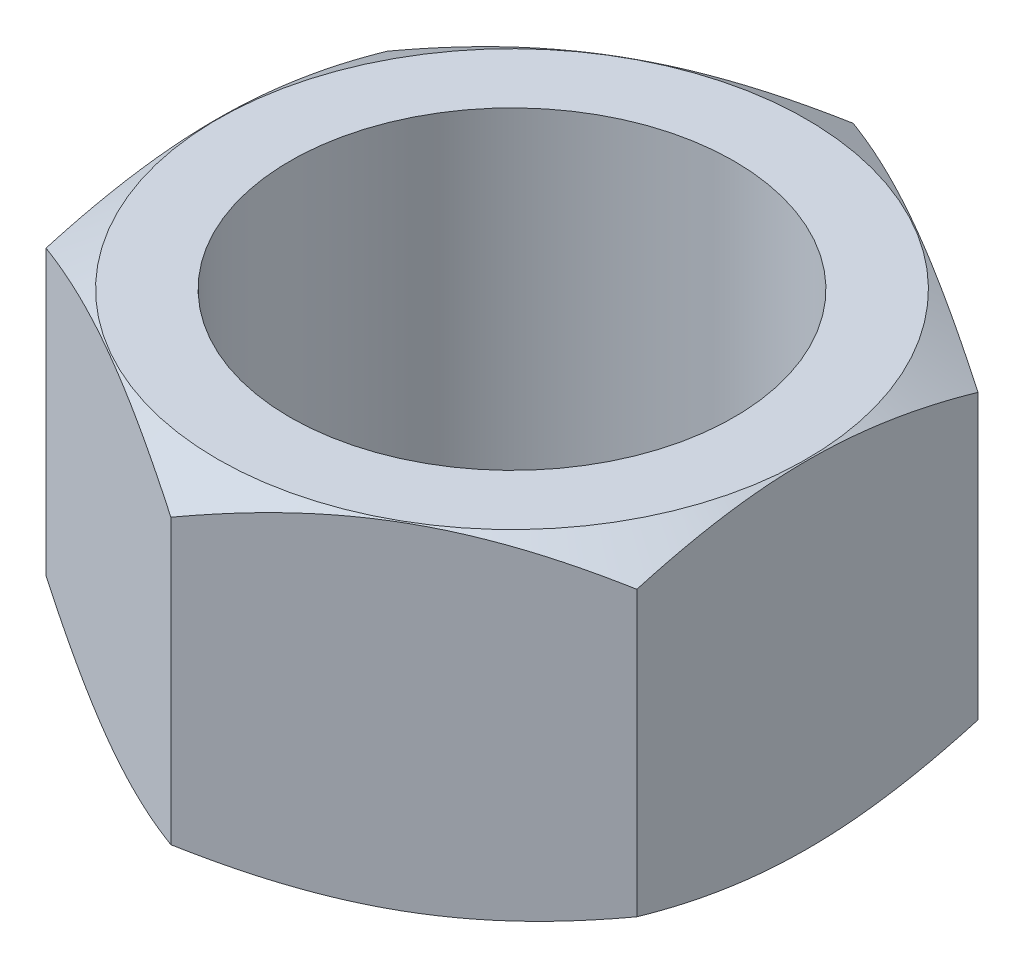
ISO-10303-21;
HEADER;
FILE_DESCRIPTION(('STEP AP214'),'2;1');
FILE_NAME('part.step','',(''),(''),'','','');
FILE_SCHEMA(('AUTOMOTIVE_DESIGN { 1 0 10303 214 1 1 1 1 }'));
ENDSEC;
DATA;
#1=APPLICATION_CONTEXT('core data for automotive mechanical design processes');
#2=APPLICATION_PROTOCOL_DEFINITION('international standard','automotive_design',2000,#1);
#3=PRODUCT_CONTEXT('',#1,'mechanical');
#4=PRODUCT('Part','Part','',(#3));
#5=PRODUCT_RELATED_PRODUCT_CATEGORY('part','',(#4));
#6=PRODUCT_DEFINITION_FORMATION('','',#4);
#7=PRODUCT_DEFINITION_CONTEXT('part definition',#1,'design');
#8=PRODUCT_DEFINITION('design','',#6,#7);
#9=PRODUCT_DEFINITION_SHAPE('','',#8);
#10=(LENGTH_UNIT() NAMED_UNIT(*) SI_UNIT(.MILLI.,.METRE.));
#11=(NAMED_UNIT(*) PLANE_ANGLE_UNIT() SI_UNIT($,.RADIAN.));
#12=(NAMED_UNIT(*) SI_UNIT($,.STERADIAN.) SOLID_ANGLE_UNIT());
#13=UNCERTAINTY_MEASURE_WITH_UNIT(LENGTH_MEASURE(1.E-05),#10,'distance_accuracy_value','');
#14=(GEOMETRIC_REPRESENTATION_CONTEXT(3) GLOBAL_UNCERTAINTY_ASSIGNED_CONTEXT((#13)) GLOBAL_UNIT_ASSIGNED_CONTEXT((#10,
#11,#12)) REPRESENTATION_CONTEXT('',''));
#15=CARTESIAN_POINT('',(0.,0.,0.));
#16=DIRECTION('',(0.,0.,1.));
#17=DIRECTION('',(1.,0.,0.));
#18=AXIS2_PLACEMENT_3D('',#15,#16,#17);
#19=CARTESIAN_POINT('',(-0.175,0.1,0.101036297108185));
#20=DIRECTION('',(0.5,0.,-0.866025403784439));
#21=DIRECTION('',(-0.866025403784439,0.,-0.5));
#22=AXIS2_PLACEMENT_3D('',#19,#20,#21);
#23=PLANE('',#22);
#24=CARTESIAN_POINT('',(0.000199999999999946,-0.0839108549334894,0.202188064270207));
#25=CARTESIAN_POINT('',(-0.0074937108815989,-0.08648024872338,0.197746098221649));
#26=CARTESIAN_POINT('',(-0.01525361122164,-0.0888181253854202,0.193265917671441));
#27=CARTESIAN_POINT('',(-0.0309080447479305,-0.0929007676395554,0.184227826261026));
#28=CARTESIAN_POINT('',(-0.0388028580338777,-0.0946440858715775,0.179669753685183));
#29=CARTESIAN_POINT('',(-0.054494971460544,-0.0973597017903497,0.170609907774143));
#30=CARTESIAN_POINT('',(-0.0622898336153238,-0.0983500501729253,0.166109542010785));
#31=CARTESIAN_POINT('',(-0.0779149577125144,-0.0995387715709246,0.157088372407151));
#32=CARTESIAN_POINT('',(-0.0857451641291545,-0.0997381199822329,0.152567600624693));
#33=CARTESIAN_POINT('',(-0.10724205060278,-0.0991579607700383,0.140156367432407));
#34=CARTESIAN_POINT('',(-0.120896921259255,-0.097535502352548,0.132272724183141));
#35=CARTESIAN_POINT('',(-0.141278654337267,-0.0935282473709126,0.120505325104));
#36=CARTESIAN_POINT('',(-0.14813257332687,-0.0919025782558418,0.116548213130348));
#37=CARTESIAN_POINT('',(-0.16173889982426,-0.0882119622722512,0.108692596864399));
#38=CARTESIAN_POINT('',(-0.16849146778477,-0.0861478110160721,0.104793999934677));
#39=CARTESIAN_POINT('',(-0.1752,-0.0839108549334894,0.100920827054347));
#40=B_SPLINE_CURVE_WITH_KNOTS('',3,(#24,#25,#26,#27,#28,#29,#30,#31,#32,#33,#34,#35,#36,#37,#38,
#39),.UNSPECIFIED.,.F.,.F.,(4,2,2,2,2,2,2,4),(0.,0.0277547258420524,0.0555765418822849,
0.0827083119886982,0.109806615018668,0.157158113827718,0.181387395708681,0.205573084193857),.UNSPECIFIED.);
#41=CARTESIAN_POINT('',(0.,-0.0839775787103655,0.202072594216368));
#42=VERTEX_POINT('',#41);
#43=CARTESIAN_POINT('',(-0.175,-0.0839775787103648,0.101036297108185));
#44=VERTEX_POINT('',#43);
#45=EDGE_CURVE('E60',#42,#44,#40,.T.);
#46=ORIENTED_EDGE('',*,*,#45,.F.);
#47=DIRECTION('',(0.,-1.,0.));
#48=VECTOR('',#47,1.);
#49=CARTESIAN_POINT('',(0.,0.1,0.202072594216369));
#50=LINE('',#49,#48);
#51=CARTESIAN_POINT('',(0.,0.0840435185201128,0.202072594216368));
#52=VERTEX_POINT('',#51);
#53=EDGE_CURVE('E53',#52,#42,#50,.T.);
#54=ORIENTED_EDGE('',*,*,#53,.F.);
#55=CARTESIAN_POINT('',(-0.1752,0.0839767947432367,0.100920827054347));
#56=CARTESIAN_POINT('',(-0.167506289118401,0.0865461885331273,0.105362793102905));
#57=CARTESIAN_POINT('',(-0.15974638877836,0.0888840651951676,0.109842973653112));
#58=CARTESIAN_POINT('',(-0.14409195525207,0.0929667074493027,0.118881065063527));
#59=CARTESIAN_POINT('',(-0.136197141966122,0.0947100256813248,0.123439137639371));
#60=CARTESIAN_POINT('',(-0.120505028539456,0.097425641600097,0.132498983550411));
#61=CARTESIAN_POINT('',(-0.112710166384676,0.0984159899826726,0.136999349313769));
#62=CARTESIAN_POINT('',(-0.0970850422874857,0.0996047113806719,0.146020518917403));
#63=CARTESIAN_POINT('',(-0.0892548358708456,0.0998040597919802,0.15054129069986));
#64=CARTESIAN_POINT('',(-0.0677579493972203,0.0992239005797856,0.162952523892147));
#65=CARTESIAN_POINT('',(-0.0541030787407451,0.0976014421622953,0.170836167141412));
#66=CARTESIAN_POINT('',(-0.033721345662733,0.0935941871806599,0.182603566220554));
#67=CARTESIAN_POINT('',(-0.0268674266731297,0.0919685180655891,0.186560678194205));
#68=CARTESIAN_POINT('',(-0.0132611001757402,0.0882779020819985,0.194416294460155));
#69=CARTESIAN_POINT('',(-0.00650853221523054,0.0862137508258194,0.198314891389876));
#70=CARTESIAN_POINT('',(0.000199999999999964,0.0839767947432367,0.202188064270207));
#71=B_SPLINE_CURVE_WITH_KNOTS('',3,(#55,#56,#57,#58,#59,#60,#61,#62,#63,#64,#65,#66,#67,#68,#69,
#70),.UNSPECIFIED.,.F.,.F.,(4,2,2,2,2,2,2,4),(0.,0.0277547258420523,0.0555765418822849,
0.0827083119886982,0.109806615018668,0.157158113827718,0.181387395708681,0.205573084193857),.UNSPECIFIED.);
#72=CARTESIAN_POINT('',(-0.175,0.0840435185201121,0.101036297108185));
#73=VERTEX_POINT('',#72);
#74=EDGE_CURVE('E138',#73,#52,#71,.T.);
#75=ORIENTED_EDGE('',*,*,#74,.F.);
#76=DIRECTION('',(0.,-1.,0.));
#77=VECTOR('',#76,1.);
#78=CARTESIAN_POINT('',(-0.175,0.1,0.101036297108185));
#79=LINE('',#78,#77);
#80=EDGE_CURVE('E115',#73,#44,#79,.T.);
#81=ORIENTED_EDGE('',*,*,#80,.T.);
#82=EDGE_LOOP('',(#46,#54,#75,#81));
#83=FACE_BOUND('',#82,.T.);
#84=ADVANCED_FACE('F39',(#83),#23,.F.);
#85=CARTESIAN_POINT('',(0.,0.1,0.202072594216369));
#86=DIRECTION('',(-0.5,0.,-0.866025403784439));
#87=DIRECTION('',(-0.866025403784439,0.,0.5));
#88=AXIS2_PLACEMENT_3D('',#85,#86,#87);
#89=PLANE('',#88);
#90=CARTESIAN_POINT('',(0.1752,-0.0839108549334894,0.100920827054347));
#91=CARTESIAN_POINT('',(0.167506289118401,-0.0864802487233801,0.105362793102905));
#92=CARTESIAN_POINT('',(0.15974638877836,-0.0888181253854203,0.109842973653112));
#93=CARTESIAN_POINT('',(0.144091955252069,-0.0929007676395554,0.118881065063527));
#94=CARTESIAN_POINT('',(0.136197141966122,-0.0946440858715775,0.123439137639371));
#95=CARTESIAN_POINT('',(0.120505028539456,-0.0973597017903497,0.132498983550411));
#96=CARTESIAN_POINT('',(0.112710166384676,-0.0983500501729253,0.136999349313769));
#97=CARTESIAN_POINT('',(0.0970850422874856,-0.0995387715709246,0.146020518917403));
#98=CARTESIAN_POINT('',(0.0892548358708456,-0.0997381199822329,0.15054129069986));
#99=CARTESIAN_POINT('',(0.0677579493972202,-0.0991579607700383,0.162952523892147));
#100=CARTESIAN_POINT('',(0.0541030787407451,-0.097535502352548,0.170836167141412));
#101=CARTESIAN_POINT('',(0.0337213456627329,-0.0935282473709126,0.182603566220554));
#102=CARTESIAN_POINT('',(0.0268674266731297,-0.0919025782558418,0.186560678194205));
#103=CARTESIAN_POINT('',(0.0132611001757401,-0.0882119622722512,0.194416294460155));
#104=CARTESIAN_POINT('',(0.00650853221523049,-0.0861478110160721,0.198314891389876));
#105=CARTESIAN_POINT('',(-0.000200000000000046,-0.0839108549334894,0.202188064270207));
#106=B_SPLINE_CURVE_WITH_KNOTS('',3,(#90,#91,#92,#93,#94,#95,#96,#97,#98,#99,#100,#101,#102,
#103,#104,#105),.UNSPECIFIED.,.F.,.F.,(4,2,2,2,2,2,2,4),(0.,0.0277547258420524,
0.0555765418822849,0.0827083119886982,0.109806615018668,0.157158113827718,0.181387395708681,
0.205573084193857),.UNSPECIFIED.);
#107=CARTESIAN_POINT('',(0.175,-0.0839775787103648,0.101036297108184));
#108=VERTEX_POINT('',#107);
#109=EDGE_CURVE('E134',#108,#42,#106,.T.);
#110=ORIENTED_EDGE('',*,*,#109,.F.);
#111=DIRECTION('',(0.,-1.,0.));
#112=VECTOR('',#111,1.);
#113=CARTESIAN_POINT('',(0.175,0.1,0.101036297108184));
#114=LINE('',#113,#112);
#115=CARTESIAN_POINT('',(0.175,0.0840435185338147,0.101036297133918));
#116=VERTEX_POINT('',#115);
#117=EDGE_CURVE('E125',#116,#108,#114,.T.);
#118=ORIENTED_EDGE('',*,*,#117,.F.);
#119=CARTESIAN_POINT('',(-0.000200000000000051,0.0839767947432367,0.202188064270207));
#120=CARTESIAN_POINT('',(0.00749371088159879,0.0865461885331273,0.197746098221649));
#121=CARTESIAN_POINT('',(0.0152536112216398,0.0888840651951676,0.193265917671441));
#122=CARTESIAN_POINT('',(0.0309080447479304,0.0929667074493027,0.184227826261026));
#123=CARTESIAN_POINT('',(0.0388028580338776,0.0947100256813248,0.179669753685183));
#124=CARTESIAN_POINT('',(0.0544949714605439,0.097425641600097,0.170609907774143));
#125=CARTESIAN_POINT('',(0.0622898336153237,0.0984159899826726,0.166109542010785));
#126=CARTESIAN_POINT('',(0.0779149577125143,0.099604711380672,0.157088372407151));
#127=CARTESIAN_POINT('',(0.0857451641291544,0.0998040597919802,0.152567600624693));
#128=CARTESIAN_POINT('',(0.10724205060278,0.0992239005797856,0.140156367432407));
#129=CARTESIAN_POINT('',(0.120896921259255,0.0976014421622953,0.132272724183141));
#130=CARTESIAN_POINT('',(0.141278654337267,0.0935941871806599,0.120505325104));
#131=CARTESIAN_POINT('',(0.14813257332687,0.0919685180655891,0.116548213130348));
#132=CARTESIAN_POINT('',(0.16173889982426,0.0882779020819986,0.108692596864399));
#133=CARTESIAN_POINT('',(0.168491467784769,0.0862137508258195,0.104793999934677));
#134=CARTESIAN_POINT('',(0.1752,0.0839767947432367,0.100920827054347));
#135=B_SPLINE_CURVE_WITH_KNOTS('',3,(#119,#120,#121,#122,#123,#124,#125,#126,#127,#128,#129,
#130,#131,#132,#133,#134),.UNSPECIFIED.,.F.,.F.,(4,2,2,2,2,2,2,4),(0.,0.0277547258420523,
0.0555765418822849,0.0827083119886982,0.109806615018668,0.157158113827718,0.181387395708681,
0.205573084193857),.UNSPECIFIED.);
#136=EDGE_CURVE('E135',#52,#116,#135,.T.);
#137=ORIENTED_EDGE('',*,*,#136,.F.);
#138=ORIENTED_EDGE('',*,*,#53,.T.);
#139=EDGE_LOOP('',(#110,#118,#137,#138));
#140=FACE_BOUND('',#139,.T.);
#141=ADVANCED_FACE('F132',(#140),#89,.F.);
#142=CARTESIAN_POINT('',(0.175,0.1,0.101036297108184));
#143=DIRECTION('',(-1.,0.,0.));
#144=DIRECTION('',(0.,0.,1.));
#145=AXIS2_PLACEMENT_3D('',#142,#143,#144);
#146=PLANE('',#145);
#147=CARTESIAN_POINT('',(0.175,0.0422895932351457,-0.382655915710894));
#148=CARTESIAN_POINT('',(0.175,0.0330727436131562,-0.365080805778269));
#149=CARTESIAN_POINT('',(0.175,0.0239250208724509,-0.347467542984239));
#150=CARTESIAN_POINT('',(0.175,0.0058745090921353,-0.312085832869629));
#151=CARTESIAN_POINT('',(0.175,-0.00302792649170072,-0.294317205716732));
#152=CARTESIAN_POINT('',(0.175,-0.0209542752882,-0.257570859999184));
#153=CARTESIAN_POINT('',(0.175,-0.029955944858787,-0.238582177080006));
#154=CARTESIAN_POINT('',(0.175,-0.047240303020974,-0.20028836082484));
#155=CARTESIAN_POINT('',(0.175,-0.055523400933287,-0.180983415192714));
#156=CARTESIAN_POINT('',(0.175,-0.0716478569374931,-0.139834837148152));
#157=CARTESIAN_POINT('',(0.175,-0.0793534511725074,-0.117936142668139));
#158=CARTESIAN_POINT('',(0.175,-0.091565599523792,-0.0736649849921621));
#159=CARTESIAN_POINT('',(0.175,-0.0961385194604931,-0.051313401426804));
#160=CARTESIAN_POINT('',(0.175,-0.0993366812364518,-0.0171949722496616));
#161=CARTESIAN_POINT('',(0.175,-0.0997778466929678,-0.00560451620327899));
#162=CARTESIAN_POINT('',(0.175,-0.0993204141178539,0.0175488549520587));
#163=CARTESIAN_POINT('',(0.175,-0.0984217739672306,0.029111769183746));
#164=CARTESIAN_POINT('',(0.175,-0.0953958138127121,0.0523291828036099));
#165=CARTESIAN_POINT('',(0.175,-0.0932416928059721,0.0639800283462536));
#166=CARTESIAN_POINT('',(0.175,-0.0879613207981097,0.0870592097042493));
#167=CARTESIAN_POINT('',(0.175,-0.0848344123187147,0.0984873894585864));
#168=CARTESIAN_POINT('',(0.175,-0.0737869744950067,0.134532281625198));
#169=CARTESIAN_POINT('',(0.175,-0.0645745438817558,0.158742117475776));
#170=CARTESIAN_POINT('',(0.175,-0.0446345954033697,0.206539986704181));
#171=CARTESIAN_POINT('',(0.175,-0.033903964688386,0.230126621343133));
#172=CARTESIAN_POINT('',(0.175,-0.0124170779125606,0.275349799704907));
#173=CARTESIAN_POINT('',(0.175,-0.00171151394898988,0.297010448534193));
#174=CARTESIAN_POINT('',(0.175,0.0200665743867666,0.340015636465542));
#175=CARTESIAN_POINT('',(0.175,0.0311370686834192,0.361361198848282));
#176=CARTESIAN_POINT('',(0.175,0.0422895932351456,0.382655915710894));
#177=B_SPLINE_CURVE_WITH_KNOTS('',3,(#147,#148,#149,#150,#151,#152,#153,#154,#155,#156,#157,
#158,#159,#160,#161,#162,#163,#164,#165,#166,#167,#168,#169,#170,#171,#172,#173,#174,#175,#176),
.UNSPECIFIED.,.F.,.F.,(4,2,2,2,2,2,2,2,2,2,2,2,2,2,4),(0.,0.0595381664677372,0.119158060575418,
0.182192517886849,0.245190829758866,0.314747742330619,0.38278129721614,0.417500686440851,
0.452221167149692,0.48771148444748,0.523225840904367,0.600792873322725,0.678521314765829,
0.750999346963575,0.823126092267287),.UNSPECIFIED.);
#178=CARTESIAN_POINT('',(0.174999999999999,-0.0839775787103655,-0.101036297108185));
#179=VERTEX_POINT('',#178);
#180=EDGE_CURVE('E143',#179,#108,#177,.T.);
#181=ORIENTED_EDGE('',*,*,#180,.F.);
#182=DIRECTION('',(0.,-1.,0.));
#183=VECTOR('',#182,1.);
#184=CARTESIAN_POINT('',(0.175,0.1,-0.101036297108185));
#185=LINE('',#184,#183);
#186=CARTESIAN_POINT('',(0.174999999999999,0.0840435185201128,-0.101036297108185));
#187=VERTEX_POINT('',#186);
#188=EDGE_CURVE('E117',#187,#179,#185,.T.);
#189=ORIENTED_EDGE('',*,*,#188,.F.);
#190=CARTESIAN_POINT('',(0.175,-0.0422160195523276,0.382641376287039));
#191=CARTESIAN_POINT('',(0.175,-0.0329995049644952,0.365066788456258));
#192=CARTESIAN_POINT('',(0.175,-0.0238521200310131,0.347454046439632));
#193=CARTESIAN_POINT('',(0.175,-0.00580229266206557,0.312073372677754));
#194=CARTESIAN_POINT('',(0.175,0.00309979627185199,0.294305261078483));
#195=CARTESIAN_POINT('',(0.175,0.0210254104002451,0.257559986629171));
#196=CARTESIAN_POINT('',(0.175,0.0300266915011207,0.238571859315599));
#197=CARTESIAN_POINT('',(0.175,0.0473102505481433,0.200279150607368));
#198=CARTESIAN_POINT('',(0.175,0.0555929378565586,0.180974756932192));
#199=CARTESIAN_POINT('',(0.175,0.0717166057194088,0.1398270755635));
#200=CARTESIAN_POINT('',(0.175,0.079421801019417,0.117928718266305));
#201=CARTESIAN_POINT('',(0.175,0.0916330577897624,0.0736582389845543));
#202=CARTESIAN_POINT('',(0.175,0.0962054861934968,0.0513069958144394));
#203=CARTESIAN_POINT('',(0.175,0.0994029430841635,0.0171891920441579));
#204=CARTESIAN_POINT('',(0.175,0.0998438787923667,0.00559898160459053));
#205=CARTESIAN_POINT('',(0.175,0.099386053659298,-0.0175538774894773));
#206=CARTESIAN_POINT('',(0.175,0.0984872504572312,-0.0291165252609038));
#207=CARTESIAN_POINT('',(0.175,0.0954610442698862,-0.0523333883517469));
#208=CARTESIAN_POINT('',(0.175,0.0933068427800365,-0.0639839497939355));
#209=CARTESIAN_POINT('',(0.175,0.0880263847492042,-0.0870625695638328));
#210=CARTESIAN_POINT('',(0.175,0.0848994709625687,-0.0984904718798404));
#211=CARTESIAN_POINT('',(0.175,0.0738524249766441,-0.134533414221554));
#212=CARTESIAN_POINT('',(0.175,0.0646406250760388,-0.158741645360664));
#213=CARTESIAN_POINT('',(0.175,0.0447020969809935,-0.206536373306849));
#214=CARTESIAN_POINT('',(0.175,0.0339722567886575,-0.23012147178013));
#215=CARTESIAN_POINT('',(0.175,0.0124869109886767,-0.275341791344504));
#216=CARTESIAN_POINT('',(0.175,0.00178209135297784,-0.297001114506236));
#217=CARTESIAN_POINT('',(0.175,-0.0199945009407727,-0.340003683609622));
#218=CARTESIAN_POINT('',(0.175,-0.0310642439056464,-0.361347952631343));
#219=CARTESIAN_POINT('',(0.175,-0.0422160195523277,-0.38264137628704));
#220=B_SPLINE_CURVE_WITH_KNOTS('',3,(#190,#191,#192,#193,#194,#195,#196,#197,#198,#199,#200,
#201,#202,#203,#204,#205,#206,#207,#208,#209,#210,#211,#212,#213,#214,#215,#216,#217,#218,#219),
.UNSPECIFIED.,.F.,.F.,(4,2,2,2,2,2,2,2,2,2,2,2,2,2,4),(0.,0.0595363126319899,0.119154357928515,
0.182186808727986,0.24518311268493,0.31473866002924,0.382770907070877,0.417489538025976,
0.452209266762136,0.487698796640793,0.523212358486987,0.600774250179695,0.67849751268021,
0.750970991052047,0.823093255266633),.UNSPECIFIED.);
#221=EDGE_CURVE('E197',#116,#187,#220,.T.);
#222=ORIENTED_EDGE('',*,*,#221,.F.);
#223=ORIENTED_EDGE('',*,*,#117,.T.);
#224=EDGE_LOOP('',(#181,#189,#222,#223));
#225=FACE_BOUND('',#224,.T.);
#226=ADVANCED_FACE('F188',(#225),#146,.F.);
#227=CARTESIAN_POINT('',(0.175,0.1,-0.101036297108185));
#228=DIRECTION('',(-0.5,0.,0.866025403784439));
#229=DIRECTION('',(0.866025403784439,0.,0.5));
#230=AXIS2_PLACEMENT_3D('',#227,#228,#229);
#231=PLANE('',#230);
#232=CARTESIAN_POINT('',(-0.000199999999999998,-0.0839108549334893,-0.202188064270207));
#233=CARTESIAN_POINT('',(0.00749371088159883,-0.08648024872338,-0.197746098221649));
#234=CARTESIAN_POINT('',(0.0152536112216399,-0.0888181253854202,-0.193265917671441));
#235=CARTESIAN_POINT('',(0.0309080447479305,-0.0929007676395554,-0.184227826261026));
#236=CARTESIAN_POINT('',(0.0388028580338777,-0.0946440858715774,-0.179669753685183));
#237=CARTESIAN_POINT('',(0.054494971460544,-0.0973597017903496,-0.170609907774143));
#238=CARTESIAN_POINT('',(0.0622898336153238,-0.0983500501729253,-0.166109542010785));
#239=CARTESIAN_POINT('',(0.0779149577125144,-0.0995387715709246,-0.157088372407151));
#240=CARTESIAN_POINT('',(0.0857451641291545,-0.0997381199822329,-0.152567600624693));
#241=CARTESIAN_POINT('',(0.10724205060278,-0.0991579607700383,-0.140156367432407));
#242=CARTESIAN_POINT('',(0.120896921259255,-0.097535502352548,-0.132272724183141));
#243=CARTESIAN_POINT('',(0.141278654337267,-0.0935282473709126,-0.120505325104));
#244=CARTESIAN_POINT('',(0.14813257332687,-0.0919025782558418,-0.116548213130349));
#245=CARTESIAN_POINT('',(0.16173889982426,-0.0882119622722512,-0.108692596864399));
#246=CARTESIAN_POINT('',(0.168491467784769,-0.0861478110160721,-0.104793999934677));
#247=CARTESIAN_POINT('',(0.1752,-0.0839108549334894,-0.100920827054347));
#248=B_SPLINE_CURVE_WITH_KNOTS('',3,(#232,#233,#234,#235,#236,#237,#238,#239,#240,#241,#242,
#243,#244,#245,#246,#247),.UNSPECIFIED.,.F.,.F.,(4,2,2,2,2,2,2,4),(0.,0.0277547258420524,
0.0555765418822849,0.0827083119886983,0.109806615018668,0.157158113827718,0.181387395708681,
0.205573084193857),.UNSPECIFIED.);
#249=CARTESIAN_POINT('',(0.,-0.0839775787103654,-0.202072594216368));
#250=VERTEX_POINT('',#249);
#251=EDGE_CURVE('E112',#250,#179,#248,.T.);
#252=ORIENTED_EDGE('',*,*,#251,.F.);
#253=DIRECTION('',(0.,-1.,0.));
#254=VECTOR('',#253,1.);
#255=CARTESIAN_POINT('',(0.,0.1,-0.202072594216369));
#256=LINE('',#255,#254);
#257=CARTESIAN_POINT('',(0.,0.0840435185201128,-0.202072594216368));
#258=VERTEX_POINT('',#257);
#259=EDGE_CURVE('E111',#258,#250,#256,.T.);
#260=ORIENTED_EDGE('',*,*,#259,.F.);
#261=CARTESIAN_POINT('',(0.1752,0.0839767947432367,-0.100920827054347));
#262=CARTESIAN_POINT('',(0.167506289118401,0.0865461885331273,-0.105362793102905));
#263=CARTESIAN_POINT('',(0.15974638877836,0.0888840651951676,-0.109842973653112));
#264=CARTESIAN_POINT('',(0.14409195525207,0.0929667074493027,-0.118881065063527));
#265=CARTESIAN_POINT('',(0.136197141966122,0.0947100256813248,-0.123439137639371));
#266=CARTESIAN_POINT('',(0.120505028539456,0.097425641600097,-0.132498983550411));
#267=CARTESIAN_POINT('',(0.112710166384676,0.0984159899826726,-0.136999349313769));
#268=CARTESIAN_POINT('',(0.0970850422874856,0.0996047113806719,-0.146020518917403));
#269=CARTESIAN_POINT('',(0.0892548358708455,0.0998040597919801,-0.150541290699861));
#270=CARTESIAN_POINT('',(0.0677579493972202,0.0992239005797856,-0.162952523892147));
#271=CARTESIAN_POINT('',(0.0541030787407451,0.0976014421622953,-0.170836167141412));
#272=CARTESIAN_POINT('',(0.0337213456627329,0.0935941871806599,-0.182603566220554));
#273=CARTESIAN_POINT('',(0.0268674266731297,0.0919685180655891,-0.186560678194205));
#274=CARTESIAN_POINT('',(0.0132611001757402,0.0882779020819985,-0.194416294460155));
#275=CARTESIAN_POINT('',(0.00650853221523054,0.0862137508258194,-0.198314891389876));
#276=CARTESIAN_POINT('',(-0.000199999999999996,0.0839767947432367,-0.202188064270207));
#277=B_SPLINE_CURVE_WITH_KNOTS('',3,(#261,#262,#263,#264,#265,#266,#267,#268,#269,#270,#271,
#272,#273,#274,#275,#276),.UNSPECIFIED.,.F.,.F.,(4,2,2,2,2,2,2,4),(0.,0.0277547258420523,
0.0555765418822849,0.0827083119886983,0.109806615018668,0.157158113827718,0.181387395708681,
0.205573084193857),.UNSPECIFIED.);
#278=EDGE_CURVE('E204',#187,#258,#277,.T.);
#279=ORIENTED_EDGE('',*,*,#278,.F.);
#280=ORIENTED_EDGE('',*,*,#188,.T.);
#281=EDGE_LOOP('',(#252,#260,#279,#280));
#282=FACE_BOUND('',#281,.T.);
#283=ADVANCED_FACE('F191',(#282),#231,.F.);
#284=CARTESIAN_POINT('',(0.,0.1,-0.202072594216369));
#285=DIRECTION('',(0.5,0.,0.866025403784439));
#286=DIRECTION('',(0.866025403784439,0.,-0.5));
#287=AXIS2_PLACEMENT_3D('',#284,#285,#286);
#288=PLANE('',#287);
#289=CARTESIAN_POINT('',(-0.1752,-0.0839108549334893,-0.100920827054347));
#290=CARTESIAN_POINT('',(-0.167506289118401,-0.08648024872338,-0.105362793102905));
#291=CARTESIAN_POINT('',(-0.15974638877836,-0.0888181253854202,-0.109842973653112));
#292=CARTESIAN_POINT('',(-0.14409195525207,-0.0929007676395554,-0.118881065063527));
#293=CARTESIAN_POINT('',(-0.136197141966122,-0.0946440858715775,-0.123439137639371));
#294=CARTESIAN_POINT('',(-0.120505028539456,-0.0973597017903496,-0.132498983550411));
#295=CARTESIAN_POINT('',(-0.112710166384676,-0.0983500501729253,-0.136999349313769));
#296=CARTESIAN_POINT('',(-0.0970850422874856,-0.0995387715709246,-0.146020518917403));
#297=CARTESIAN_POINT('',(-0.0892548358708456,-0.0997381199822328,-0.150541290699861));
#298=CARTESIAN_POINT('',(-0.0677579493972202,-0.0991579607700383,-0.162952523892147));
#299=CARTESIAN_POINT('',(-0.0541030787407451,-0.097535502352548,-0.170836167141412));
#300=CARTESIAN_POINT('',(-0.0337213456627329,-0.0935282473709126,-0.182603566220554));
#301=CARTESIAN_POINT('',(-0.0268674266731297,-0.0919025782558417,-0.186560678194205));
#302=CARTESIAN_POINT('',(-0.0132611001757402,-0.0882119622722512,-0.194416294460155));
#303=CARTESIAN_POINT('',(-0.00650853221523055,-0.0861478110160721,-0.198314891389876));
#304=CARTESIAN_POINT('',(0.000199999999999985,-0.0839108549334894,-0.202188064270207));
#305=B_SPLINE_CURVE_WITH_KNOTS('',3,(#289,#290,#291,#292,#293,#294,#295,#296,#297,#298,#299,
#300,#301,#302,#303,#304),.UNSPECIFIED.,.F.,.F.,(4,2,2,2,2,2,2,4),(0.,0.0277547258420523,
0.0555765418822849,0.0827083119886982,0.109806615018668,0.157158113827718,0.181387395708681,
0.205573084193857),.UNSPECIFIED.);
#306=CARTESIAN_POINT('',(-0.175,-0.0839775787103648,-0.101036297108185));
#307=VERTEX_POINT('',#306);
#308=EDGE_CURVE('E97',#307,#250,#305,.T.);
#309=ORIENTED_EDGE('',*,*,#308,.F.);
#310=DIRECTION('',(0.,-1.,0.));
#311=VECTOR('',#310,1.);
#312=CARTESIAN_POINT('',(-0.175,0.1,-0.101036297108185));
#313=LINE('',#312,#311);
#314=CARTESIAN_POINT('',(-0.175,0.0840435185201121,-0.101036297108185));
#315=VERTEX_POINT('',#314);
#316=EDGE_CURVE('E109',#315,#307,#313,.T.);
#317=ORIENTED_EDGE('',*,*,#316,.F.);
#318=CARTESIAN_POINT('',(0.000199999999999997,0.0839767947432367,-0.202188064270207));
#319=CARTESIAN_POINT('',(-0.00749371088159886,0.0865461885331273,-0.197746098221649));
#320=CARTESIAN_POINT('',(-0.0152536112216399,0.0888840651951675,-0.193265917671441));
#321=CARTESIAN_POINT('',(-0.0309080447479305,0.0929667074493027,-0.184227826261026));
#322=CARTESIAN_POINT('',(-0.0388028580338777,0.0947100256813247,-0.179669753685183));
#323=CARTESIAN_POINT('',(-0.054494971460544,0.0974256416000969,-0.170609907774143));
#324=CARTESIAN_POINT('',(-0.0622898336153238,0.0984159899826726,-0.166109542010785));
#325=CARTESIAN_POINT('',(-0.0779149577125144,0.0996047113806719,-0.157088372407151));
#326=CARTESIAN_POINT('',(-0.0857451641291545,0.0998040597919801,-0.152567600624693));
#327=CARTESIAN_POINT('',(-0.10724205060278,0.0992239005797856,-0.140156367432407));
#328=CARTESIAN_POINT('',(-0.120896921259255,0.0976014421622953,-0.132272724183141));
#329=CARTESIAN_POINT('',(-0.141278654337267,0.0935941871806599,-0.120505325104));
#330=CARTESIAN_POINT('',(-0.14813257332687,0.0919685180655891,-0.116548213130349));
#331=CARTESIAN_POINT('',(-0.16173889982426,0.0882779020819985,-0.108692596864399));
#332=CARTESIAN_POINT('',(-0.16849146778477,0.0862137508258194,-0.104793999934677));
#333=CARTESIAN_POINT('',(-0.1752,0.0839767947432367,-0.100920827054347));
#334=B_SPLINE_CURVE_WITH_KNOTS('',3,(#318,#319,#320,#321,#322,#323,#324,#325,#326,#327,#328,
#329,#330,#331,#332,#333),.UNSPECIFIED.,.F.,.F.,(4,2,2,2,2,2,2,4),(0.,0.0277547258420524,
0.0555765418822849,0.0827083119886983,0.109806615018668,0.157158113827718,0.181387395708681,
0.205573084193857),.UNSPECIFIED.);
#335=EDGE_CURVE('E67',#258,#315,#334,.T.);
#336=ORIENTED_EDGE('',*,*,#335,.F.);
#337=ORIENTED_EDGE('',*,*,#259,.T.);
#338=EDGE_LOOP('',(#309,#317,#336,#337));
#339=FACE_BOUND('',#338,.T.);
#340=ADVANCED_FACE('F108',(#339),#288,.F.);
#341=CARTESIAN_POINT('',(-0.175,0.1,-0.101036297108185));
#342=DIRECTION('',(1.,0.,0.));
#343=DIRECTION('',(0.,0.,-1.));
#344=AXIS2_PLACEMENT_3D('',#341,#342,#343);
#345=PLANE('',#344);
#346=CARTESIAN_POINT('',(-0.175,0.0422895932351457,0.382655915710894));
#347=CARTESIAN_POINT('',(-0.175,0.0330727436131562,0.365080805778269));
#348=CARTESIAN_POINT('',(-0.175,0.0239250208724509,0.347467542984239));
#349=CARTESIAN_POINT('',(-0.175,0.00587450909213527,0.312085832869629));
#350=CARTESIAN_POINT('',(-0.175,-0.00302792649170074,0.294317205716732));
#351=CARTESIAN_POINT('',(-0.175,-0.0209542752882,0.257570859999184));
#352=CARTESIAN_POINT('',(-0.175,-0.029955944858787,0.238582177080006));
#353=CARTESIAN_POINT('',(-0.175,-0.047240303020974,0.20028836082484));
#354=CARTESIAN_POINT('',(-0.175,-0.0555234009332869,0.180983415192714));
#355=CARTESIAN_POINT('',(-0.175,-0.0716478569374931,0.139834837148152));
#356=CARTESIAN_POINT('',(-0.175,-0.0793534511725074,0.117936142668139));
#357=CARTESIAN_POINT('',(-0.175,-0.0915655995237919,0.0736649849921621));
#358=CARTESIAN_POINT('',(-0.175,-0.0961385194604931,0.051313401426804));
#359=CARTESIAN_POINT('',(-0.175,-0.0993366812364518,0.0171949722496615));
#360=CARTESIAN_POINT('',(-0.175,-0.0997778466929678,0.00560451620327885));
#361=CARTESIAN_POINT('',(-0.175,-0.0993204141178538,-0.0175488549520589));
#362=CARTESIAN_POINT('',(-0.175,-0.0984217739672306,-0.0291117691837462));
#363=CARTESIAN_POINT('',(-0.175,-0.0953958138127121,-0.05232918280361));
#364=CARTESIAN_POINT('',(-0.175,-0.0932416928059721,-0.0639800283462538));
#365=CARTESIAN_POINT('',(-0.175,-0.0879613207981097,-0.0870592097042495));
#366=CARTESIAN_POINT('',(-0.175,-0.0848344123187146,-0.0984873894585866));
#367=CARTESIAN_POINT('',(-0.175,-0.0737869744950066,-0.134532281625199));
#368=CARTESIAN_POINT('',(-0.175,-0.0645745438817558,-0.158742117475776));
#369=CARTESIAN_POINT('',(-0.175,-0.0446345954033696,-0.206539986704181));
#370=CARTESIAN_POINT('',(-0.175,-0.0339039646883859,-0.230126621343133));
#371=CARTESIAN_POINT('',(-0.175,-0.0124170779125605,-0.275349799704907));
#372=CARTESIAN_POINT('',(-0.175,-0.00171151394898983,-0.297010448534193));
#373=CARTESIAN_POINT('',(-0.175,0.0200665743867666,-0.340015636465542));
#374=CARTESIAN_POINT('',(-0.175,0.0311370686834193,-0.361361198848282));
#375=CARTESIAN_POINT('',(-0.175,0.0422895932351457,-0.382655915710894));
#376=B_SPLINE_CURVE_WITH_KNOTS('',3,(#346,#347,#348,#349,#350,#351,#352,#353,#354,#355,#356,
#357,#358,#359,#360,#361,#362,#363,#364,#365,#366,#367,#368,#369,#370,#371,#372,#373,#374,#375),
.UNSPECIFIED.,.F.,.F.,(4,2,2,2,2,2,2,2,2,2,2,2,2,2,4),(0.,0.0595381664677373,0.119158060575418,
0.182192517886849,0.245190829758866,0.314747742330618,0.38278129721614,0.417500686440852,
0.452221167149692,0.487711484447481,0.523225840904367,0.600792873322725,0.678521314765829,
0.750999346963575,0.823126092267287),.UNSPECIFIED.);
#377=EDGE_CURVE('E94',#44,#307,#376,.T.);
#378=ORIENTED_EDGE('',*,*,#377,.F.);
#379=ORIENTED_EDGE('',*,*,#80,.F.);
#380=CARTESIAN_POINT('',(-0.175,-0.0422160195523277,-0.38264137628704));
#381=CARTESIAN_POINT('',(-0.175,-0.0329995049644953,-0.365066788456258));
#382=CARTESIAN_POINT('',(-0.175,-0.0238521200310131,-0.347454046439632));
#383=CARTESIAN_POINT('',(-0.175,-0.00580229266206554,-0.312073372677754));
#384=CARTESIAN_POINT('',(-0.175,0.00309979627185202,-0.294305261078482));
#385=CARTESIAN_POINT('',(-0.175,0.0210254104002452,-0.257559986629171));
#386=CARTESIAN_POINT('',(-0.175,0.0300266915011207,-0.238571859315599));
#387=CARTESIAN_POINT('',(-0.175,0.0473102505481433,-0.200279150607368));
#388=CARTESIAN_POINT('',(-0.175,0.0555929378565585,-0.180974756932192));
#389=CARTESIAN_POINT('',(-0.175,0.0717166057194088,-0.1398270755635));
#390=CARTESIAN_POINT('',(-0.175,0.079421801019417,-0.117928718266305));
#391=CARTESIAN_POINT('',(-0.175,0.0916330577897624,-0.0736582389845544));
#392=CARTESIAN_POINT('',(-0.175,0.0962054861934968,-0.0513069958144395));
#393=CARTESIAN_POINT('',(-0.175,0.0994029430841635,-0.0171891920441579));
#394=CARTESIAN_POINT('',(-0.175,0.0998438787923667,-0.00559898160459049));
#395=CARTESIAN_POINT('',(-0.175,0.099386053659298,0.0175538774894774));
#396=CARTESIAN_POINT('',(-0.175,0.0984872504572312,0.0291165252609039));
#397=CARTESIAN_POINT('',(-0.175,0.0954610442698862,0.0523333883517469));
#398=CARTESIAN_POINT('',(-0.175,0.0933068427800364,0.0639839497939356));
#399=CARTESIAN_POINT('',(-0.175,0.0880263847492042,0.0870625695638328));
#400=CARTESIAN_POINT('',(-0.175,0.0848994709625687,0.0984904718798404));
#401=CARTESIAN_POINT('',(-0.175,0.0738524249766441,0.134533414221554));
#402=CARTESIAN_POINT('',(-0.175,0.0646406250760388,0.158741645360664));
#403=CARTESIAN_POINT('',(-0.175,0.0447020969809936,0.206536373306849));
#404=CARTESIAN_POINT('',(-0.175,0.0339722567886576,0.23012147178013));
#405=CARTESIAN_POINT('',(-0.175,0.0124869109886768,0.275341791344504));
#406=CARTESIAN_POINT('',(-0.175,0.0017820913529779,0.297001114506236));
#407=CARTESIAN_POINT('',(-0.175,-0.0199945009407726,0.340003683609622));
#408=CARTESIAN_POINT('',(-0.175,-0.0310642439056463,0.361347952631342));
#409=CARTESIAN_POINT('',(-0.175,-0.0422160195523277,0.38264137628704));
#410=B_SPLINE_CURVE_WITH_KNOTS('',3,(#380,#381,#382,#383,#384,#385,#386,#387,#388,#389,#390,
#391,#392,#393,#394,#395,#396,#397,#398,#399,#400,#401,#402,#403,#404,#405,#406,#407,#408,#409),
.UNSPECIFIED.,.F.,.F.,(4,2,2,2,2,2,2,2,2,2,2,2,2,2,4),(0.,0.0595363126319901,0.119154357928515,
0.182186808727986,0.24518311268493,0.31473866002924,0.382770907070877,0.417489538025976,
0.452209266762136,0.487698796640793,0.523212358486988,0.600774250179695,0.67849751268021,
0.750970991052047,0.823093255266633),.UNSPECIFIED.);
#411=EDGE_CURVE('E12',#315,#73,#410,.T.);
#412=ORIENTED_EDGE('',*,*,#411,.F.);
#413=ORIENTED_EDGE('',*,*,#316,.T.);
#414=EDGE_LOOP('',(#378,#379,#412,#413));
#415=FACE_BOUND('',#414,.T.);
#416=ADVANCED_FACE('F114',(#415),#345,.F.);
#417=CARTESIAN_POINT('',(0.,-0.1,0.));
#418=DIRECTION('',(0.,1.,0.));
#419=DIRECTION('',(0.,0.,1.));
#420=AXIS2_PLACEMENT_3D('',#417,#418,#419);
#421=PLANE('',#420);
#422=CARTESIAN_POINT('',(0.,-0.1,0.));
#423=DIRECTION('',(0.,1.,0.));
#424=DIRECTION('',(0.,0.,1.));
#425=AXIS2_PLACEMENT_3D('',#422,#423,#424);
#426=CIRCLE('',#425,0.1315);
#427=CARTESIAN_POINT('',(0.,-0.1,0.1315));
#428=VERTEX_POINT('',#427);
#429=EDGE_CURVE('E219',#428,#428,#426,.T.);
#430=ORIENTED_EDGE('',*,*,#429,.T.);
#431=EDGE_LOOP('',(#430));
#432=FACE_BOUND('',#431,.T.);
#433=CARTESIAN_POINT('',(0.,-0.1,0.));
#434=DIRECTION('',(0.,-1.,0.));
#435=DIRECTION('',(0.,0.,-1.));
#436=AXIS2_PLACEMENT_3D('',#433,#434,#435);
#437=CIRCLE('',#436,0.174320946482447);
#438=CARTESIAN_POINT('',(0.,-0.1,-0.174320946482447));
#439=VERTEX_POINT('',#438);
#440=EDGE_CURVE('E103',#439,#439,#437,.T.);
#441=ORIENTED_EDGE('',*,*,#440,.T.);
#442=EDGE_LOOP('',(#441));
#443=FACE_BOUND('',#442,.T.);
#444=ADVANCED_FACE('F224',(#432,#443),#421,.F.);
#445=CARTESIAN_POINT('',(0.,0.1,0.));
#446=DIRECTION('',(0.,1.,0.));
#447=DIRECTION('',(0.,0.,1.));
#448=AXIS2_PLACEMENT_3D('',#445,#446,#447);
#449=PLANE('',#448);
#450=CARTESIAN_POINT('',(0.,0.1,0.));
#451=DIRECTION('',(0.,1.,0.));
#452=DIRECTION('',(0.,0.,1.));
#453=AXIS2_PLACEMENT_3D('',#450,#451,#452);
#454=CIRCLE('',#453,0.1315);
#455=CARTESIAN_POINT('',(0.,0.1,0.1315));
#456=VERTEX_POINT('',#455);
#457=EDGE_CURVE('E119',#456,#456,#454,.T.);
#458=ORIENTED_EDGE('',*,*,#457,.F.);
#459=EDGE_LOOP('',(#458));
#460=FACE_BOUND('',#459,.T.);
#461=CARTESIAN_POINT('',(0.,0.1,0.));
#462=DIRECTION('',(0.,1.,0.));
#463=DIRECTION('',(0.,0.,1.));
#464=AXIS2_PLACEMENT_3D('',#461,#462,#463);
#465=CIRCLE('',#464,0.174435157583171);
#466=CARTESIAN_POINT('',(0.,0.1,0.174435157583171));
#467=VERTEX_POINT('',#466);
#468=EDGE_CURVE('E139',#467,#467,#465,.T.);
#469=ORIENTED_EDGE('',*,*,#468,.T.);
#470=EDGE_LOOP('',(#469));
#471=FACE_BOUND('',#470,.T.);
#472=ADVANCED_FACE('F229',(#460,#471),#449,.T.);
#473=CARTESIAN_POINT('',(0.,0.1,0.));
#474=DIRECTION('',(0.,-1.,0.));
#475=DIRECTION('',(0.,0.,-1.));
#476=AXIS2_PLACEMENT_3D('',#473,#474,#475);
#477=CYLINDRICAL_SURFACE('',#476,0.1315);
#478=ORIENTED_EDGE('',*,*,#457,.T.);
#479=EDGE_LOOP('',(#478));
#480=FACE_BOUND('',#479,.T.);
#481=ORIENTED_EDGE('',*,*,#429,.F.);
#482=EDGE_LOOP('',(#481));
#483=FACE_BOUND('',#482,.T.);
#484=ADVANCED_FACE('F227',(#480,#483),#477,.F.);
#485=CARTESIAN_POINT('',(0.,0.1,0.));
#486=DIRECTION('',(0.,-1.,0.));
#487=DIRECTION('',(0.,0.,1.));
#488=AXIS2_PLACEMENT_3D('',#485,#486,#487);
#489=CONICAL_SURFACE('',#488,0.174435157583171,1.0471975511966);
#490=ORIENTED_EDGE('',*,*,#468,.F.);
#491=EDGE_LOOP('',(#490));
#492=FACE_BOUND('',#491,.T.);
#493=ORIENTED_EDGE('',*,*,#74,.T.);
#494=ORIENTED_EDGE('',*,*,#136,.T.);
#495=ORIENTED_EDGE('',*,*,#221,.T.);
#496=ORIENTED_EDGE('',*,*,#278,.T.);
#497=ORIENTED_EDGE('',*,*,#335,.T.);
#498=ORIENTED_EDGE('',*,*,#411,.T.);
#499=EDGE_LOOP('',(#493,#494,#495,#496,#497,#498));
#500=FACE_BOUND('',#499,.T.);
#501=ADVANCED_FACE('F158',(#492,#500),#489,.T.);
#502=CARTESIAN_POINT('',(0.,-0.1,0.));
#503=DIRECTION('',(0.,1.,0.));
#504=DIRECTION('',(0.,0.,-1.));
#505=AXIS2_PLACEMENT_3D('',#502,#503,#504);
#506=CONICAL_SURFACE('',#505,0.174320946482447,1.0471975511966);
#507=ORIENTED_EDGE('',*,*,#440,.F.);
#508=EDGE_LOOP('',(#507));
#509=FACE_BOUND('',#508,.T.);
#510=ORIENTED_EDGE('',*,*,#45,.T.);
#511=ORIENTED_EDGE('',*,*,#377,.T.);
#512=ORIENTED_EDGE('',*,*,#308,.T.);
#513=ORIENTED_EDGE('',*,*,#251,.T.);
#514=ORIENTED_EDGE('',*,*,#180,.T.);
#515=ORIENTED_EDGE('',*,*,#109,.T.);
#516=EDGE_LOOP('',(#510,#511,#512,#513,#514,#515));
#517=FACE_BOUND('',#516,.T.);
#518=ADVANCED_FACE('F96',(#509,#517),#506,.T.);
#519=CLOSED_SHELL('',(#84,#141,#226,#283,#340,#416,#444,#472,#484,#501,#518));
#520=MANIFOLD_SOLID_BREP('B2',#519);
#521=ADVANCED_BREP_SHAPE_REPRESENTATION('',(#18,#520),#14);
#522=SHAPE_DEFINITION_REPRESENTATION(#9,#521);
ENDSEC;
END-ISO-10303-21;
